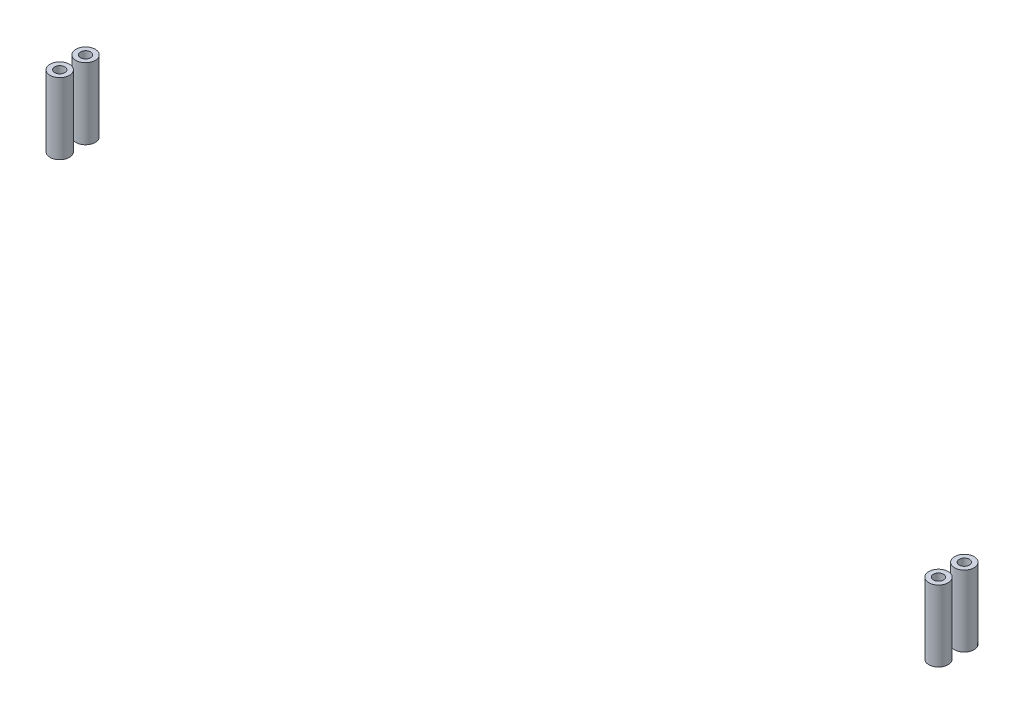
ISO-10303-21;
HEADER;
FILE_DESCRIPTION(('STEP AP214'),'2;1');
FILE_NAME('part.step','',(''),(''),'','','');
FILE_SCHEMA(('AUTOMOTIVE_DESIGN { 1 0 10303 214 1 1 1 1 }'));
ENDSEC;
DATA;
#1=APPLICATION_CONTEXT('core data for automotive mechanical design processes');
#2=APPLICATION_PROTOCOL_DEFINITION('international standard','automotive_design',2000,#1);
#3=PRODUCT_CONTEXT('',#1,'mechanical');
#4=PRODUCT('Part','Part','',(#3));
#5=PRODUCT_RELATED_PRODUCT_CATEGORY('part','',(#4));
#6=PRODUCT_DEFINITION_FORMATION('','',#4);
#7=PRODUCT_DEFINITION_CONTEXT('part definition',#1,'design');
#8=PRODUCT_DEFINITION('design','',#6,#7);
#9=PRODUCT_DEFINITION_SHAPE('','',#8);
#10=(LENGTH_UNIT() NAMED_UNIT(*) SI_UNIT(.MILLI.,.METRE.));
#11=(NAMED_UNIT(*) PLANE_ANGLE_UNIT() SI_UNIT($,.RADIAN.));
#12=(NAMED_UNIT(*) SI_UNIT($,.STERADIAN.) SOLID_ANGLE_UNIT());
#13=UNCERTAINTY_MEASURE_WITH_UNIT(LENGTH_MEASURE(1.E-05),#10,'distance_accuracy_value','');
#14=(GEOMETRIC_REPRESENTATION_CONTEXT(3) GLOBAL_UNCERTAINTY_ASSIGNED_CONTEXT((#13)) GLOBAL_UNIT_ASSIGNED_CONTEXT((#10,
#11,#12)) REPRESENTATION_CONTEXT('',''));
#15=CARTESIAN_POINT('',(0.,0.,0.));
#16=DIRECTION('',(0.,0.,1.));
#17=DIRECTION('',(1.,0.,0.));
#18=AXIS2_PLACEMENT_3D('',#15,#16,#17);
#19=CARTESIAN_POINT('',(495.3,-85.725,673.1));
#20=DIRECTION('',(0.,1.,0.));
#21=DIRECTION('',(0.,0.,1.));
#22=AXIS2_PLACEMENT_3D('',#19,#20,#21);
#23=CYLINDRICAL_SURFACE('',#22,2.4892);
#24=CARTESIAN_POINT('',(495.3,-85.725,673.1));
#25=DIRECTION('',(0.,1.,0.));
#26=DIRECTION('',(0.,0.,-1.));
#27=AXIS2_PLACEMENT_3D('',#24,#25,#26);
#28=CIRCLE('',#27,2.4892);
#29=CARTESIAN_POINT('',(495.3,-85.725,670.6108));
#30=VERTEX_POINT('',#29);
#31=EDGE_CURVE('P0_E22',#30,#30,#28,.T.);
#32=ORIENTED_EDGE('',*,*,#31,.F.);
#33=EDGE_LOOP('',(#32));
#34=FACE_BOUND('',#33,.T.);
#35=CARTESIAN_POINT('',(495.3,-50.8,673.1));
#36=DIRECTION('',(0.,1.,0.));
#37=DIRECTION('',(0.,0.,-1.));
#38=AXIS2_PLACEMENT_3D('',#35,#36,#37);
#39=CIRCLE('',#38,2.4892);
#40=CARTESIAN_POINT('',(495.3,-50.8,670.6108));
#41=VERTEX_POINT('',#40);
#42=EDGE_CURVE('P0_E28',#41,#41,#39,.T.);
#43=ORIENTED_EDGE('',*,*,#42,.T.);
#44=EDGE_LOOP('',(#43));
#45=FACE_BOUND('',#44,.T.);
#46=ADVANCED_FACE('P0_F15',(#34,#45),#23,.F.);
#47=CARTESIAN_POINT('',(495.3,-85.725,673.1));
#48=DIRECTION('',(0.,1.,0.));
#49=DIRECTION('',(0.,0.,1.));
#50=AXIS2_PLACEMENT_3D('',#47,#48,#49);
#51=CYLINDRICAL_SURFACE('',#50,4.7625);
#52=CARTESIAN_POINT('',(495.3,-85.725,673.1));
#53=DIRECTION('',(0.,1.,0.));
#54=DIRECTION('',(0.,0.,-1.));
#55=AXIS2_PLACEMENT_3D('',#52,#53,#54);
#56=CIRCLE('',#55,4.7625);
#57=CARTESIAN_POINT('',(495.3,-85.725,668.3375));
#58=VERTEX_POINT('',#57);
#59=EDGE_CURVE('P0_E10',#58,#58,#56,.T.);
#60=ORIENTED_EDGE('',*,*,#59,.T.);
#61=EDGE_LOOP('',(#60));
#62=FACE_BOUND('',#61,.T.);
#63=CARTESIAN_POINT('',(495.3,-50.8,673.1));
#64=DIRECTION('',(0.,1.,0.));
#65=DIRECTION('',(0.,0.,-1.));
#66=AXIS2_PLACEMENT_3D('',#63,#64,#65);
#67=CIRCLE('',#66,4.7625);
#68=CARTESIAN_POINT('',(495.3,-50.8,668.3375));
#69=VERTEX_POINT('',#68);
#70=EDGE_CURVE('P0_E18',#69,#69,#67,.T.);
#71=ORIENTED_EDGE('',*,*,#70,.F.);
#72=EDGE_LOOP('',(#71));
#73=FACE_BOUND('',#72,.T.);
#74=ADVANCED_FACE('P0_F37',(#62,#73),#51,.T.);
#75=CARTESIAN_POINT('',(495.3,-85.725,393.7));
#76=DIRECTION('',(0.,-1.,0.));
#77=DIRECTION('',(-1.,0.,0.));
#78=AXIS2_PLACEMENT_3D('',#75,#76,#77);
#79=PLANE('',#78);
#80=ORIENTED_EDGE('',*,*,#31,.T.);
#81=EDGE_LOOP('',(#80));
#82=FACE_BOUND('',#81,.T.);
#83=ORIENTED_EDGE('',*,*,#59,.F.);
#84=EDGE_LOOP('',(#83));
#85=FACE_BOUND('',#84,.T.);
#86=ADVANCED_FACE('P0_F39',(#82,#85),#79,.T.);
#87=CARTESIAN_POINT('',(495.3,-50.8,393.7));
#88=DIRECTION('',(0.,-1.,0.));
#89=DIRECTION('',(-1.,0.,0.));
#90=AXIS2_PLACEMENT_3D('',#87,#88,#89);
#91=PLANE('',#90);
#92=ORIENTED_EDGE('',*,*,#42,.F.);
#93=EDGE_LOOP('',(#92));
#94=FACE_BOUND('',#93,.T.);
#95=ORIENTED_EDGE('',*,*,#70,.T.);
#96=EDGE_LOOP('',(#95));
#97=FACE_BOUND('',#96,.T.);
#98=ADVANCED_FACE('P0_F35',(#94,#97),#91,.F.);
#99=CLOSED_SHELL('',(#46,#74,#86,#98));
#100=MANIFOLD_SOLID_BREP('P0_B1',#99);
#101=CARTESIAN_POINT('',(63.5,-85.725,673.1));
#102=DIRECTION('',(0.,1.,0.));
#103=DIRECTION('',(0.,0.,1.));
#104=AXIS2_PLACEMENT_3D('',#101,#102,#103);
#105=CYLINDRICAL_SURFACE('',#104,2.4892);
#106=CARTESIAN_POINT('',(63.5,-85.725,673.1));
#107=DIRECTION('',(0.,-1.,0.));
#108=DIRECTION('',(0.,0.,-1.));
#109=AXIS2_PLACEMENT_3D('',#106,#107,#108);
#110=CIRCLE('',#109,2.4892);
#111=CARTESIAN_POINT('',(63.5,-85.725,670.6108));
#112=VERTEX_POINT('',#111);
#113=EDGE_CURVE('P1_E22',#112,#112,#110,.T.);
#114=ORIENTED_EDGE('',*,*,#113,.T.);
#115=EDGE_LOOP('',(#114));
#116=FACE_BOUND('',#115,.T.);
#117=CARTESIAN_POINT('',(63.5,-50.8,673.1));
#118=DIRECTION('',(0.,-1.,0.));
#119=DIRECTION('',(0.,0.,-1.));
#120=AXIS2_PLACEMENT_3D('',#117,#118,#119);
#121=CIRCLE('',#120,2.4892);
#122=CARTESIAN_POINT('',(63.5,-50.8,670.6108));
#123=VERTEX_POINT('',#122);
#124=EDGE_CURVE('P1_E28',#123,#123,#121,.T.);
#125=ORIENTED_EDGE('',*,*,#124,.F.);
#126=EDGE_LOOP('',(#125));
#127=FACE_BOUND('',#126,.T.);
#128=ADVANCED_FACE('P1_F15',(#116,#127),#105,.F.);
#129=CARTESIAN_POINT('',(63.5,-85.725,673.1));
#130=DIRECTION('',(0.,1.,0.));
#131=DIRECTION('',(0.,0.,1.));
#132=AXIS2_PLACEMENT_3D('',#129,#130,#131);
#133=CYLINDRICAL_SURFACE('',#132,4.7625);
#134=CARTESIAN_POINT('',(63.5,-85.725,673.1));
#135=DIRECTION('',(0.,-1.,0.));
#136=DIRECTION('',(0.,0.,-1.));
#137=AXIS2_PLACEMENT_3D('',#134,#135,#136);
#138=CIRCLE('',#137,4.7625);
#139=CARTESIAN_POINT('',(63.5,-85.725,668.3375));
#140=VERTEX_POINT('',#139);
#141=EDGE_CURVE('P1_E10',#140,#140,#138,.T.);
#142=ORIENTED_EDGE('',*,*,#141,.F.);
#143=EDGE_LOOP('',(#142));
#144=FACE_BOUND('',#143,.T.);
#145=CARTESIAN_POINT('',(63.5,-50.8,673.1));
#146=DIRECTION('',(0.,-1.,0.));
#147=DIRECTION('',(0.,0.,-1.));
#148=AXIS2_PLACEMENT_3D('',#145,#146,#147);
#149=CIRCLE('',#148,4.7625);
#150=CARTESIAN_POINT('',(63.5,-50.8,668.3375));
#151=VERTEX_POINT('',#150);
#152=EDGE_CURVE('P1_E18',#151,#151,#149,.T.);
#153=ORIENTED_EDGE('',*,*,#152,.T.);
#154=EDGE_LOOP('',(#153));
#155=FACE_BOUND('',#154,.T.);
#156=ADVANCED_FACE('P1_F35',(#144,#155),#133,.T.);
#157=CARTESIAN_POINT('',(63.5,-85.725,393.7));
#158=DIRECTION('',(0.,-1.,0.));
#159=DIRECTION('',(1.,0.,0.));
#160=AXIS2_PLACEMENT_3D('',#157,#158,#159);
#161=PLANE('',#160);
#162=ORIENTED_EDGE('',*,*,#113,.F.);
#163=EDGE_LOOP('',(#162));
#164=FACE_BOUND('',#163,.T.);
#165=ORIENTED_EDGE('',*,*,#141,.T.);
#166=EDGE_LOOP('',(#165));
#167=FACE_BOUND('',#166,.T.);
#168=ADVANCED_FACE('P1_F39',(#164,#167),#161,.T.);
#169=CARTESIAN_POINT('',(63.5,-50.8,393.7));
#170=DIRECTION('',(0.,-1.,0.));
#171=DIRECTION('',(1.,0.,0.));
#172=AXIS2_PLACEMENT_3D('',#169,#170,#171);
#173=PLANE('',#172);
#174=ORIENTED_EDGE('',*,*,#124,.T.);
#175=EDGE_LOOP('',(#174));
#176=FACE_BOUND('',#175,.T.);
#177=ORIENTED_EDGE('',*,*,#152,.F.);
#178=EDGE_LOOP('',(#177));
#179=FACE_BOUND('',#178,.T.);
#180=ADVANCED_FACE('P1_F37',(#176,#179),#173,.F.);
#181=CLOSED_SHELL('',(#128,#156,#168,#180));
#182=MANIFOLD_SOLID_BREP('P1_B1',#181);
#183=CARTESIAN_POINT('',(495.3,-85.725,660.4));
#184=DIRECTION('',(0.,1.,0.));
#185=DIRECTION('',(0.,0.,1.));
#186=AXIS2_PLACEMENT_3D('',#183,#184,#185);
#187=CYLINDRICAL_SURFACE('',#186,2.4892);
#188=CARTESIAN_POINT('',(495.3,-85.725,660.4));
#189=DIRECTION('',(0.,1.,0.));
#190=DIRECTION('',(0.,0.,-1.));
#191=AXIS2_PLACEMENT_3D('',#188,#189,#190);
#192=CIRCLE('',#191,2.4892);
#193=CARTESIAN_POINT('',(495.3,-85.725,657.9108));
#194=VERTEX_POINT('',#193);
#195=EDGE_CURVE('P2_E22',#194,#194,#192,.T.);
#196=ORIENTED_EDGE('',*,*,#195,.F.);
#197=EDGE_LOOP('',(#196));
#198=FACE_BOUND('',#197,.T.);
#199=CARTESIAN_POINT('',(495.3,-50.8,660.4));
#200=DIRECTION('',(0.,1.,0.));
#201=DIRECTION('',(0.,0.,-1.));
#202=AXIS2_PLACEMENT_3D('',#199,#200,#201);
#203=CIRCLE('',#202,2.4892);
#204=CARTESIAN_POINT('',(495.3,-50.8,657.9108));
#205=VERTEX_POINT('',#204);
#206=EDGE_CURVE('P2_E28',#205,#205,#203,.T.);
#207=ORIENTED_EDGE('',*,*,#206,.T.);
#208=EDGE_LOOP('',(#207));
#209=FACE_BOUND('',#208,.T.);
#210=ADVANCED_FACE('P2_F15',(#198,#209),#187,.F.);
#211=CARTESIAN_POINT('',(495.3,-85.725,660.4));
#212=DIRECTION('',(0.,1.,0.));
#213=DIRECTION('',(0.,0.,1.));
#214=AXIS2_PLACEMENT_3D('',#211,#212,#213);
#215=CYLINDRICAL_SURFACE('',#214,4.7625);
#216=CARTESIAN_POINT('',(495.3,-85.725,660.4));
#217=DIRECTION('',(0.,1.,0.));
#218=DIRECTION('',(0.,0.,-1.));
#219=AXIS2_PLACEMENT_3D('',#216,#217,#218);
#220=CIRCLE('',#219,4.7625);
#221=CARTESIAN_POINT('',(495.3,-85.725,655.6375));
#222=VERTEX_POINT('',#221);
#223=EDGE_CURVE('P2_E10',#222,#222,#220,.T.);
#224=ORIENTED_EDGE('',*,*,#223,.T.);
#225=EDGE_LOOP('',(#224));
#226=FACE_BOUND('',#225,.T.);
#227=CARTESIAN_POINT('',(495.3,-50.8,660.4));
#228=DIRECTION('',(0.,1.,0.));
#229=DIRECTION('',(0.,0.,-1.));
#230=AXIS2_PLACEMENT_3D('',#227,#228,#229);
#231=CIRCLE('',#230,4.7625);
#232=CARTESIAN_POINT('',(495.3,-50.8,655.6375));
#233=VERTEX_POINT('',#232);
#234=EDGE_CURVE('P2_E18',#233,#233,#231,.T.);
#235=ORIENTED_EDGE('',*,*,#234,.F.);
#236=EDGE_LOOP('',(#235));
#237=FACE_BOUND('',#236,.T.);
#238=ADVANCED_FACE('P2_F37',(#226,#237),#215,.T.);
#239=CARTESIAN_POINT('',(495.3,-85.725,381.));
#240=DIRECTION('',(0.,-1.,0.));
#241=DIRECTION('',(-1.,0.,0.));
#242=AXIS2_PLACEMENT_3D('',#239,#240,#241);
#243=PLANE('',#242);
#244=ORIENTED_EDGE('',*,*,#195,.T.);
#245=EDGE_LOOP('',(#244));
#246=FACE_BOUND('',#245,.T.);
#247=ORIENTED_EDGE('',*,*,#223,.F.);
#248=EDGE_LOOP('',(#247));
#249=FACE_BOUND('',#248,.T.);
#250=ADVANCED_FACE('P2_F39',(#246,#249),#243,.T.);
#251=CARTESIAN_POINT('',(495.3,-50.8,381.));
#252=DIRECTION('',(0.,-1.,0.));
#253=DIRECTION('',(-1.,0.,0.));
#254=AXIS2_PLACEMENT_3D('',#251,#252,#253);
#255=PLANE('',#254);
#256=ORIENTED_EDGE('',*,*,#206,.F.);
#257=EDGE_LOOP('',(#256));
#258=FACE_BOUND('',#257,.T.);
#259=ORIENTED_EDGE('',*,*,#234,.T.);
#260=EDGE_LOOP('',(#259));
#261=FACE_BOUND('',#260,.T.);
#262=ADVANCED_FACE('P2_F35',(#258,#261),#255,.F.);
#263=CLOSED_SHELL('',(#210,#238,#250,#262));
#264=MANIFOLD_SOLID_BREP('P2_B1',#263);
#265=CARTESIAN_POINT('',(63.5,-85.725,660.4));
#266=DIRECTION('',(0.,1.,0.));
#267=DIRECTION('',(0.,0.,1.));
#268=AXIS2_PLACEMENT_3D('',#265,#266,#267);
#269=CYLINDRICAL_SURFACE('',#268,2.4892);
#270=CARTESIAN_POINT('',(63.5,-85.725,660.4));
#271=DIRECTION('',(0.,-1.,0.));
#272=DIRECTION('',(0.,0.,-1.));
#273=AXIS2_PLACEMENT_3D('',#270,#271,#272);
#274=CIRCLE('',#273,2.4892);
#275=CARTESIAN_POINT('',(63.5,-85.725,657.9108));
#276=VERTEX_POINT('',#275);
#277=EDGE_CURVE('P3_E22',#276,#276,#274,.T.);
#278=ORIENTED_EDGE('',*,*,#277,.T.);
#279=EDGE_LOOP('',(#278));
#280=FACE_BOUND('',#279,.T.);
#281=CARTESIAN_POINT('',(63.5,-50.8,660.4));
#282=DIRECTION('',(0.,-1.,0.));
#283=DIRECTION('',(0.,0.,-1.));
#284=AXIS2_PLACEMENT_3D('',#281,#282,#283);
#285=CIRCLE('',#284,2.4892);
#286=CARTESIAN_POINT('',(63.5,-50.8,657.9108));
#287=VERTEX_POINT('',#286);
#288=EDGE_CURVE('P3_E28',#287,#287,#285,.T.);
#289=ORIENTED_EDGE('',*,*,#288,.F.);
#290=EDGE_LOOP('',(#289));
#291=FACE_BOUND('',#290,.T.);
#292=ADVANCED_FACE('P3_F15',(#280,#291),#269,.F.);
#293=CARTESIAN_POINT('',(63.5,-85.725,660.4));
#294=DIRECTION('',(0.,1.,0.));
#295=DIRECTION('',(0.,0.,1.));
#296=AXIS2_PLACEMENT_3D('',#293,#294,#295);
#297=CYLINDRICAL_SURFACE('',#296,4.7625);
#298=CARTESIAN_POINT('',(63.5,-85.725,660.4));
#299=DIRECTION('',(0.,-1.,0.));
#300=DIRECTION('',(0.,0.,-1.));
#301=AXIS2_PLACEMENT_3D('',#298,#299,#300);
#302=CIRCLE('',#301,4.7625);
#303=CARTESIAN_POINT('',(63.5,-85.725,655.6375));
#304=VERTEX_POINT('',#303);
#305=EDGE_CURVE('P3_E10',#304,#304,#302,.T.);
#306=ORIENTED_EDGE('',*,*,#305,.F.);
#307=EDGE_LOOP('',(#306));
#308=FACE_BOUND('',#307,.T.);
#309=CARTESIAN_POINT('',(63.5,-50.8,660.4));
#310=DIRECTION('',(0.,-1.,0.));
#311=DIRECTION('',(0.,0.,-1.));
#312=AXIS2_PLACEMENT_3D('',#309,#310,#311);
#313=CIRCLE('',#312,4.7625);
#314=CARTESIAN_POINT('',(63.5,-50.8,655.6375));
#315=VERTEX_POINT('',#314);
#316=EDGE_CURVE('P3_E18',#315,#315,#313,.T.);
#317=ORIENTED_EDGE('',*,*,#316,.T.);
#318=EDGE_LOOP('',(#317));
#319=FACE_BOUND('',#318,.T.);
#320=ADVANCED_FACE('P3_F35',(#308,#319),#297,.T.);
#321=CARTESIAN_POINT('',(63.5,-85.725,381.));
#322=DIRECTION('',(0.,-1.,0.));
#323=DIRECTION('',(1.,0.,0.));
#324=AXIS2_PLACEMENT_3D('',#321,#322,#323);
#325=PLANE('',#324);
#326=ORIENTED_EDGE('',*,*,#277,.F.);
#327=EDGE_LOOP('',(#326));
#328=FACE_BOUND('',#327,.T.);
#329=ORIENTED_EDGE('',*,*,#305,.T.);
#330=EDGE_LOOP('',(#329));
#331=FACE_BOUND('',#330,.T.);
#332=ADVANCED_FACE('P3_F39',(#328,#331),#325,.T.);
#333=CARTESIAN_POINT('',(63.5,-50.8,381.));
#334=DIRECTION('',(0.,-1.,0.));
#335=DIRECTION('',(1.,0.,0.));
#336=AXIS2_PLACEMENT_3D('',#333,#334,#335);
#337=PLANE('',#336);
#338=ORIENTED_EDGE('',*,*,#288,.T.);
#339=EDGE_LOOP('',(#338));
#340=FACE_BOUND('',#339,.T.);
#341=ORIENTED_EDGE('',*,*,#316,.F.);
#342=EDGE_LOOP('',(#341));
#343=FACE_BOUND('',#342,.T.);
#344=ADVANCED_FACE('P3_F37',(#340,#343),#337,.F.);
#345=CLOSED_SHELL('',(#292,#320,#332,#344));
#346=MANIFOLD_SOLID_BREP('P3_B1',#345);
#347=ADVANCED_BREP_SHAPE_REPRESENTATION('',(#18,#100,#182,#264,#346),#14);
#348=SHAPE_DEFINITION_REPRESENTATION(#9,#347);
ENDSEC;
END-ISO-10303-21;
